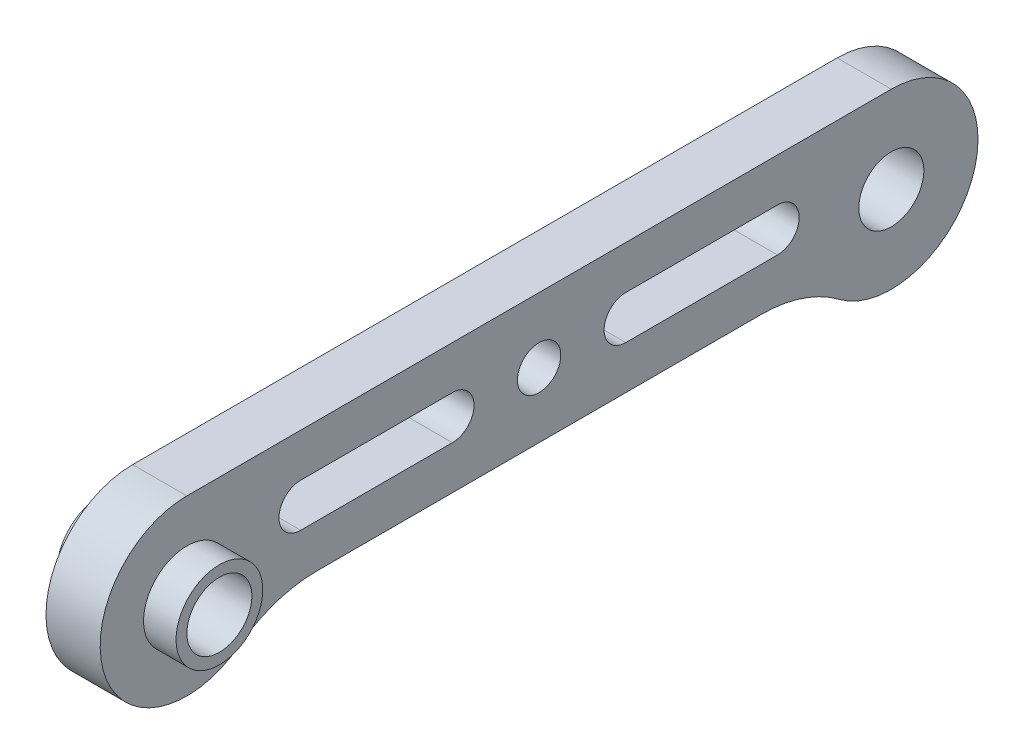
ISO-10303-21;
HEADER;
FILE_DESCRIPTION(('STEP AP214'),'2;1');
FILE_NAME('part.step','',(''),(''),'','','');
FILE_SCHEMA(('AUTOMOTIVE_DESIGN { 1 0 10303 214 1 1 1 1 }'));
ENDSEC;
DATA;
#1=APPLICATION_CONTEXT('core data for automotive mechanical design processes');
#2=APPLICATION_PROTOCOL_DEFINITION('international standard','automotive_design',2000,#1);
#3=PRODUCT_CONTEXT('',#1,'mechanical');
#4=PRODUCT('Part','Part','',(#3));
#5=PRODUCT_RELATED_PRODUCT_CATEGORY('part','',(#4));
#6=PRODUCT_DEFINITION_FORMATION('','',#4);
#7=PRODUCT_DEFINITION_CONTEXT('part definition',#1,'design');
#8=PRODUCT_DEFINITION('design','',#6,#7);
#9=PRODUCT_DEFINITION_SHAPE('','',#8);
#10=(LENGTH_UNIT() NAMED_UNIT(*) SI_UNIT(.MILLI.,.METRE.));
#11=(NAMED_UNIT(*) PLANE_ANGLE_UNIT() SI_UNIT($,.RADIAN.));
#12=(NAMED_UNIT(*) SI_UNIT($,.STERADIAN.) SOLID_ANGLE_UNIT());
#13=UNCERTAINTY_MEASURE_WITH_UNIT(LENGTH_MEASURE(1.E-05),#10,'distance_accuracy_value','');
#14=(GEOMETRIC_REPRESENTATION_CONTEXT(3) GLOBAL_UNCERTAINTY_ASSIGNED_CONTEXT((#13)) GLOBAL_UNIT_ASSIGNED_CONTEXT((#10,
#11,#12)) REPRESENTATION_CONTEXT('',''));
#15=CARTESIAN_POINT('',(0.,0.,0.));
#16=DIRECTION('',(0.,0.,1.));
#17=DIRECTION('',(1.,0.,0.));
#18=AXIS2_PLACEMENT_3D('',#15,#16,#17);
#19=CARTESIAN_POINT('',(5.,0.,0.));
#20=DIRECTION('',(1.,0.,0.));
#21=DIRECTION('',(0.,0.,1.));
#22=AXIS2_PLACEMENT_3D('',#19,#20,#21);
#23=PLANE('',#22);
#24=DIRECTION('',(0.,0.,-1.));
#25=VECTOR('',#24,1.);
#26=CARTESIAN_POINT('',(5.,-4.,0.));
#27=LINE('',#26,#25);
#28=CARTESIAN_POINT('',(5.,-4.,-12.));
#29=VERTEX_POINT('',#28);
#30=CARTESIAN_POINT('',(5.,-4.00000000000001,-53.));
#31=VERTEX_POINT('',#30);
#32=EDGE_CURVE('E218',#29,#31,#27,.T.);
#33=ORIENTED_EDGE('',*,*,#32,.T.);
#34=CARTESIAN_POINT('',(5.,-16.,-53.));
#35=DIRECTION('',(-1.,0.,0.));
#36=DIRECTION('',(0.,0.,1.));
#37=AXIS2_PLACEMENT_3D('',#34,#35,#36);
#38=CIRCLE('',#37,12.);
#39=CARTESIAN_POINT('',(5.,-6.40000000000001,-60.2));
#40=VERTEX_POINT('',#39);
#41=EDGE_CURVE('E47',#40,#31,#38,.F.);
#42=ORIENTED_EDGE('',*,*,#41,.F.);
#43=CARTESIAN_POINT('',(5.,0.,-65.));
#44=DIRECTION('',(-1.,0.,0.));
#45=DIRECTION('',(0.,0.,1.));
#46=AXIS2_PLACEMENT_3D('',#43,#44,#45);
#47=CIRCLE('',#46,8.);
#48=CARTESIAN_POINT('',(5.,7.99999999999999,-65.));
#49=VERTEX_POINT('',#48);
#50=EDGE_CURVE('E228',#49,#40,#47,.T.);
#51=ORIENTED_EDGE('',*,*,#50,.F.);
#52=DIRECTION('',(0.,0.,1.));
#53=VECTOR('',#52,1.);
#54=CARTESIAN_POINT('',(5.,8.,0.));
#55=LINE('',#54,#53);
#56=CARTESIAN_POINT('',(5.,8.,0.));
#57=VERTEX_POINT('',#56);
#58=EDGE_CURVE('E225',#49,#57,#55,.T.);
#59=ORIENTED_EDGE('',*,*,#58,.T.);
#60=CARTESIAN_POINT('',(5.,0.,0.));
#61=DIRECTION('',(-1.,0.,0.));
#62=DIRECTION('',(0.,0.,1.));
#63=AXIS2_PLACEMENT_3D('',#60,#61,#62);
#64=CIRCLE('',#63,8.);
#65=CARTESIAN_POINT('',(5.,-6.4,-4.8));
#66=VERTEX_POINT('',#65);
#67=EDGE_CURVE('E222',#66,#57,#64,.T.);
#68=ORIENTED_EDGE('',*,*,#67,.F.);
#69=CARTESIAN_POINT('',(5.,-16.,-12.));
#70=DIRECTION('',(-1.,0.,0.));
#71=DIRECTION('',(0.,0.,1.));
#72=AXIS2_PLACEMENT_3D('',#69,#70,#71);
#73=CIRCLE('',#72,12.);
#74=EDGE_CURVE('E259',#29,#66,#73,.F.);
#75=ORIENTED_EDGE('',*,*,#74,.F.);
#76=EDGE_LOOP('',(#33,#42,#51,#59,#68,#75));
#77=FACE_BOUND('',#76,.T.);
#78=CARTESIAN_POINT('',(5.,0.,-65.));
#79=DIRECTION('',(-1.,0.,0.));
#80=DIRECTION('',(0.,0.,1.));
#81=AXIS2_PLACEMENT_3D('',#78,#79,#80);
#82=CIRCLE('',#81,3.00000000000001);
#83=CARTESIAN_POINT('',(5.,0.,-62.));
#84=VERTEX_POINT('',#83);
#85=EDGE_CURVE('E215',#84,#84,#82,.T.);
#86=ORIENTED_EDGE('',*,*,#85,.T.);
#87=EDGE_LOOP('',(#86));
#88=FACE_BOUND('',#87,.T.);
#89=CARTESIAN_POINT('',(5.,1.99999999999999,-32.5));
#90=DIRECTION('',(-1.,0.,0.));
#91=DIRECTION('',(0.,0.,1.));
#92=AXIS2_PLACEMENT_3D('',#89,#90,#91);
#93=CIRCLE('',#92,2.);
#94=CARTESIAN_POINT('',(5.,1.99999999999999,-30.5));
#95=VERTEX_POINT('',#94);
#96=EDGE_CURVE('E176',#95,#95,#93,.T.);
#97=ORIENTED_EDGE('',*,*,#96,.T.);
#98=EDGE_LOOP('',(#97));
#99=FACE_BOUND('',#98,.T.);
#100=CARTESIAN_POINT('',(5.,1.99999999999999,-54.5));
#101=DIRECTION('',(-1.,0.,0.));
#102=DIRECTION('',(0.,0.,1.));
#103=AXIS2_PLACEMENT_3D('',#100,#101,#102);
#104=CIRCLE('',#103,2.);
#105=CARTESIAN_POINT('',(5.,3.99999999999999,-54.5));
#106=VERTEX_POINT('',#105);
#107=CARTESIAN_POINT('',(5.,0.,-54.5));
#108=VERTEX_POINT('',#107);
#109=EDGE_CURVE('E163',#106,#108,#104,.T.);
#110=ORIENTED_EDGE('',*,*,#109,.T.);
#111=DIRECTION('',(0.,0.,1.));
#112=VECTOR('',#111,1.);
#113=CARTESIAN_POINT('',(5.,0.,-54.5));
#114=LINE('',#113,#112);
#115=CARTESIAN_POINT('',(5.,0.,-40.5));
#116=VERTEX_POINT('',#115);
#117=EDGE_CURVE('E145',#108,#116,#114,.T.);
#118=ORIENTED_EDGE('',*,*,#117,.T.);
#119=CARTESIAN_POINT('',(5.,1.99999999999999,-40.5));
#120=DIRECTION('',(-1.,0.,0.));
#121=DIRECTION('',(0.,0.,1.));
#122=AXIS2_PLACEMENT_3D('',#119,#120,#121);
#123=CIRCLE('',#122,2.);
#124=CARTESIAN_POINT('',(5.,3.99999999999999,-40.5));
#125=VERTEX_POINT('',#124);
#126=EDGE_CURVE('E155',#116,#125,#123,.T.);
#127=ORIENTED_EDGE('',*,*,#126,.T.);
#128=DIRECTION('',(0.,0.,-1.));
#129=VECTOR('',#128,1.);
#130=CARTESIAN_POINT('',(5.,3.99999999999999,-54.5));
#131=LINE('',#130,#129);
#132=EDGE_CURVE('E160',#125,#106,#131,.T.);
#133=ORIENTED_EDGE('',*,*,#132,.T.);
#134=EDGE_LOOP('',(#110,#118,#127,#133));
#135=FACE_BOUND('',#134,.T.);
#136=CARTESIAN_POINT('',(5.,1.99999999999999,-24.5));
#137=DIRECTION('',(-1.,0.,0.));
#138=DIRECTION('',(0.,0.,1.));
#139=AXIS2_PLACEMENT_3D('',#136,#137,#138);
#140=CIRCLE('',#139,2.);
#141=CARTESIAN_POINT('',(5.,3.99999999999999,-24.5));
#142=VERTEX_POINT('',#141);
#143=CARTESIAN_POINT('',(5.,0.,-24.5));
#144=VERTEX_POINT('',#143);
#145=EDGE_CURVE('E188',#142,#144,#140,.T.);
#146=ORIENTED_EDGE('',*,*,#145,.T.);
#147=DIRECTION('',(0.,0.,1.));
#148=VECTOR('',#147,1.);
#149=CARTESIAN_POINT('',(5.,0.,-24.5));
#150=LINE('',#149,#148);
#151=CARTESIAN_POINT('',(5.,0.,-10.5));
#152=VERTEX_POINT('',#151);
#153=EDGE_CURVE('E191',#144,#152,#150,.T.);
#154=ORIENTED_EDGE('',*,*,#153,.T.);
#155=CARTESIAN_POINT('',(5.,1.99999999999999,-10.5));
#156=DIRECTION('',(-1.,0.,0.));
#157=DIRECTION('',(0.,0.,1.));
#158=AXIS2_PLACEMENT_3D('',#155,#156,#157);
#159=CIRCLE('',#158,2.);
#160=CARTESIAN_POINT('',(5.,3.99999999999999,-10.5));
#161=VERTEX_POINT('',#160);
#162=EDGE_CURVE('E195',#152,#161,#159,.T.);
#163=ORIENTED_EDGE('',*,*,#162,.T.);
#164=DIRECTION('',(0.,0.,-1.));
#165=VECTOR('',#164,1.);
#166=CARTESIAN_POINT('',(5.,3.99999999999999,-24.5));
#167=LINE('',#166,#165);
#168=EDGE_CURVE('E198',#161,#142,#167,.T.);
#169=ORIENTED_EDGE('',*,*,#168,.T.);
#170=EDGE_LOOP('',(#146,#154,#163,#169));
#171=FACE_BOUND('',#170,.T.);
#172=CARTESIAN_POINT('',(5.,0.,0.));
#173=DIRECTION('',(-1.,0.,0.));
#174=DIRECTION('',(0.,0.,1.));
#175=AXIS2_PLACEMENT_3D('',#172,#173,#174);
#176=CIRCLE('',#175,4.);
#177=CARTESIAN_POINT('',(5.,0.,4.));
#178=VERTEX_POINT('',#177);
#179=EDGE_CURVE('E332',#178,#178,#176,.T.);
#180=ORIENTED_EDGE('',*,*,#179,.T.);
#181=EDGE_LOOP('',(#180));
#182=FACE_BOUND('',#181,.T.);
#183=ADVANCED_FACE('F39',(#77,#88,#99,#135,#171,#182),#23,.T.);
#184=CARTESIAN_POINT('',(0.,0.,0.));
#185=DIRECTION('',(1.,0.,0.));
#186=DIRECTION('',(0.,0.,1.));
#187=AXIS2_PLACEMENT_3D('',#184,#185,#186);
#188=PLANE('',#187);
#189=CARTESIAN_POINT('',(0.,0.,0.));
#190=DIRECTION('',(-1.,0.,0.));
#191=DIRECTION('',(0.,0.,1.));
#192=AXIS2_PLACEMENT_3D('',#189,#190,#191);
#193=CIRCLE('',#192,8.);
#194=CARTESIAN_POINT('',(0.,-6.4,-4.8));
#195=VERTEX_POINT('',#194);
#196=CARTESIAN_POINT('',(0.,8.,0.));
#197=VERTEX_POINT('',#196);
#198=EDGE_CURVE('E237',#195,#197,#193,.T.);
#199=ORIENTED_EDGE('',*,*,#198,.T.);
#200=DIRECTION('',(0.,0.,1.));
#201=VECTOR('',#200,1.);
#202=CARTESIAN_POINT('',(0.,8.,0.));
#203=LINE('',#202,#201);
#204=CARTESIAN_POINT('',(0.,7.99999999999999,-65.));
#205=VERTEX_POINT('',#204);
#206=EDGE_CURVE('E240',#205,#197,#203,.T.);
#207=ORIENTED_EDGE('',*,*,#206,.F.);
#208=CARTESIAN_POINT('',(0.,0.,-65.));
#209=DIRECTION('',(-1.,0.,0.));
#210=DIRECTION('',(0.,0.,1.));
#211=AXIS2_PLACEMENT_3D('',#208,#209,#210);
#212=CIRCLE('',#211,8.);
#213=CARTESIAN_POINT('',(0.,-6.40000000000001,-60.2));
#214=VERTEX_POINT('',#213);
#215=EDGE_CURVE('E219',#205,#214,#212,.T.);
#216=ORIENTED_EDGE('',*,*,#215,.T.);
#217=CARTESIAN_POINT('',(0.,-16.,-53.));
#218=DIRECTION('',(-1.,0.,0.));
#219=DIRECTION('',(0.,0.,1.));
#220=AXIS2_PLACEMENT_3D('',#217,#218,#219);
#221=CIRCLE('',#220,12.);
#222=CARTESIAN_POINT('',(0.,-4.00000000000001,-53.));
#223=VERTEX_POINT('',#222);
#224=EDGE_CURVE('E262',#223,#214,#221,.T.);
#225=ORIENTED_EDGE('',*,*,#224,.F.);
#226=DIRECTION('',(0.,0.,-1.));
#227=VECTOR('',#226,1.);
#228=CARTESIAN_POINT('',(0.,-4.,0.));
#229=LINE('',#228,#227);
#230=CARTESIAN_POINT('',(0.,-4.,-12.));
#231=VERTEX_POINT('',#230);
#232=EDGE_CURVE('E234',#231,#223,#229,.T.);
#233=ORIENTED_EDGE('',*,*,#232,.F.);
#234=CARTESIAN_POINT('',(0.,-16.,-12.));
#235=DIRECTION('',(-1.,0.,0.));
#236=DIRECTION('',(0.,0.,1.));
#237=AXIS2_PLACEMENT_3D('',#234,#235,#236);
#238=CIRCLE('',#237,12.);
#239=EDGE_CURVE('E256',#195,#231,#238,.T.);
#240=ORIENTED_EDGE('',*,*,#239,.F.);
#241=EDGE_LOOP('',(#199,#207,#216,#225,#233,#240));
#242=FACE_BOUND('',#241,.T.);
#243=CARTESIAN_POINT('',(0.,0.,-65.));
#244=DIRECTION('',(-1.,0.,0.));
#245=DIRECTION('',(0.,0.,1.));
#246=AXIS2_PLACEMENT_3D('',#243,#244,#245);
#247=CIRCLE('',#246,3.00000000000001);
#248=CARTESIAN_POINT('',(0.,0.,-62.));
#249=VERTEX_POINT('',#248);
#250=EDGE_CURVE('E214',#249,#249,#247,.T.);
#251=ORIENTED_EDGE('',*,*,#250,.F.);
#252=EDGE_LOOP('',(#251));
#253=FACE_BOUND('',#252,.T.);
#254=CARTESIAN_POINT('',(0.,1.99999999999999,-32.5));
#255=DIRECTION('',(-1.,0.,0.));
#256=DIRECTION('',(0.,0.,1.));
#257=AXIS2_PLACEMENT_3D('',#254,#255,#256);
#258=CIRCLE('',#257,2.);
#259=CARTESIAN_POINT('',(0.,1.99999999999999,-30.5));
#260=VERTEX_POINT('',#259);
#261=EDGE_CURVE('E211',#260,#260,#258,.F.);
#262=ORIENTED_EDGE('',*,*,#261,.T.);
#263=EDGE_LOOP('',(#262));
#264=FACE_BOUND('',#263,.T.);
#265=DIRECTION('',(0.,0.,1.));
#266=VECTOR('',#265,1.);
#267=CARTESIAN_POINT('',(0.,3.99999999999999,-54.5));
#268=LINE('',#267,#266);
#269=CARTESIAN_POINT('',(0.,3.99999999999999,-54.5));
#270=VERTEX_POINT('',#269);
#271=CARTESIAN_POINT('',(0.,3.99999999999999,-40.5));
#272=VERTEX_POINT('',#271);
#273=EDGE_CURVE('E344',#270,#272,#268,.T.);
#274=ORIENTED_EDGE('',*,*,#273,.T.);
#275=CARTESIAN_POINT('',(0.,1.99999999999999,-40.5));
#276=DIRECTION('',(-1.,0.,0.));
#277=DIRECTION('',(0.,0.,1.));
#278=AXIS2_PLACEMENT_3D('',#275,#276,#277);
#279=CIRCLE('',#278,2.);
#280=CARTESIAN_POINT('',(0.,0.,-40.5));
#281=VERTEX_POINT('',#280);
#282=EDGE_CURVE('E172',#272,#281,#279,.F.);
#283=ORIENTED_EDGE('',*,*,#282,.T.);
#284=DIRECTION('',(0.,0.,-1.));
#285=VECTOR('',#284,1.);
#286=CARTESIAN_POINT('',(0.,0.,-54.5));
#287=LINE('',#286,#285);
#288=CARTESIAN_POINT('',(0.,0.,-54.5));
#289=VERTEX_POINT('',#288);
#290=EDGE_CURVE('E148',#281,#289,#287,.T.);
#291=ORIENTED_EDGE('',*,*,#290,.T.);
#292=CARTESIAN_POINT('',(0.,1.99999999999999,-54.5));
#293=DIRECTION('',(-1.,0.,0.));
#294=DIRECTION('',(0.,0.,1.));
#295=AXIS2_PLACEMENT_3D('',#292,#293,#294);
#296=CIRCLE('',#295,2.);
#297=EDGE_CURVE('E177',#289,#270,#296,.F.);
#298=ORIENTED_EDGE('',*,*,#297,.T.);
#299=EDGE_LOOP('',(#274,#283,#291,#298));
#300=FACE_BOUND('',#299,.T.);
#301=DIRECTION('',(0.,0.,1.));
#302=VECTOR('',#301,1.);
#303=CARTESIAN_POINT('',(0.,3.99999999999999,-24.5));
#304=LINE('',#303,#302);
#305=CARTESIAN_POINT('',(0.,3.99999999999999,-24.5));
#306=VERTEX_POINT('',#305);
#307=CARTESIAN_POINT('',(0.,3.99999999999999,-10.5));
#308=VERTEX_POINT('',#307);
#309=EDGE_CURVE('E181',#306,#308,#304,.T.);
#310=ORIENTED_EDGE('',*,*,#309,.T.);
#311=CARTESIAN_POINT('',(0.,1.99999999999999,-10.5));
#312=DIRECTION('',(-1.,0.,0.));
#313=DIRECTION('',(0.,0.,1.));
#314=AXIS2_PLACEMENT_3D('',#311,#312,#313);
#315=CIRCLE('',#314,2.);
#316=CARTESIAN_POINT('',(0.,0.,-10.5));
#317=VERTEX_POINT('',#316);
#318=EDGE_CURVE('E178',#308,#317,#315,.F.);
#319=ORIENTED_EDGE('',*,*,#318,.T.);
#320=DIRECTION('',(0.,0.,-1.));
#321=VECTOR('',#320,1.);
#322=CARTESIAN_POINT('',(0.,0.,-24.5));
#323=LINE('',#322,#321);
#324=CARTESIAN_POINT('',(0.,0.,-24.5));
#325=VERTEX_POINT('',#324);
#326=EDGE_CURVE('E165',#317,#325,#323,.T.);
#327=ORIENTED_EDGE('',*,*,#326,.T.);
#328=CARTESIAN_POINT('',(0.,1.99999999999999,-24.5));
#329=DIRECTION('',(-1.,0.,0.));
#330=DIRECTION('',(0.,0.,1.));
#331=AXIS2_PLACEMENT_3D('',#328,#329,#330);
#332=CIRCLE('',#331,2.);
#333=EDGE_CURVE('E185',#325,#306,#332,.F.);
#334=ORIENTED_EDGE('',*,*,#333,.T.);
#335=EDGE_LOOP('',(#310,#319,#327,#334));
#336=FACE_BOUND('',#335,.T.);
#337=CARTESIAN_POINT('',(0.,0.,0.));
#338=DIRECTION('',(-1.,0.,0.));
#339=DIRECTION('',(0.,0.,1.));
#340=AXIS2_PLACEMENT_3D('',#337,#338,#339);
#341=CIRCLE('',#340,4.);
#342=CARTESIAN_POINT('',(0.,0.,4.));
#343=VERTEX_POINT('',#342);
#344=EDGE_CURVE('E11',#343,#343,#341,.F.);
#345=ORIENTED_EDGE('',*,*,#344,.T.);
#346=EDGE_LOOP('',(#345));
#347=FACE_BOUND('',#346,.T.);
#348=ADVANCED_FACE('F279',(#242,#253,#264,#300,#336,#347),#188,.F.);
#349=CARTESIAN_POINT('',(5.,-4.,0.));
#350=DIRECTION('',(0.,-1.,0.));
#351=DIRECTION('',(0.,0.,1.));
#352=AXIS2_PLACEMENT_3D('',#349,#350,#351);
#353=PLANE('',#352);
#354=ORIENTED_EDGE('',*,*,#232,.T.);
#355=DIRECTION('',(-1.,0.,0.));
#356=VECTOR('',#355,1.);
#357=CARTESIAN_POINT('',(5.,-4.00000000000001,-53.));
#358=LINE('',#357,#356);
#359=EDGE_CURVE('E250',#31,#223,#358,.T.);
#360=ORIENTED_EDGE('',*,*,#359,.F.);
#361=ORIENTED_EDGE('',*,*,#32,.F.);
#362=DIRECTION('',(-1.,0.,0.));
#363=VECTOR('',#362,1.);
#364=CARTESIAN_POINT('',(5.,-4.,-12.));
#365=LINE('',#364,#363);
#366=EDGE_CURVE('E252',#231,#29,#365,.F.);
#367=ORIENTED_EDGE('',*,*,#366,.F.);
#368=EDGE_LOOP('',(#354,#360,#361,#367));
#369=FACE_BOUND('',#368,.T.);
#370=ADVANCED_FACE('F274',(#369),#353,.T.);
#371=CARTESIAN_POINT('',(5.,0.,0.));
#372=DIRECTION('',(-1.,0.,0.));
#373=DIRECTION('',(0.,0.,-1.));
#374=AXIS2_PLACEMENT_3D('',#371,#372,#373);
#375=CYLINDRICAL_SURFACE('',#374,8.);
#376=ORIENTED_EDGE('',*,*,#67,.T.);
#377=DIRECTION('',(-1.,0.,0.));
#378=VECTOR('',#377,1.);
#379=CARTESIAN_POINT('',(5.,8.,0.));
#380=LINE('',#379,#378);
#381=EDGE_CURVE('E246',#57,#197,#380,.T.);
#382=ORIENTED_EDGE('',*,*,#381,.T.);
#383=ORIENTED_EDGE('',*,*,#198,.F.);
#384=DIRECTION('',(-1.,0.,0.));
#385=VECTOR('',#384,1.);
#386=CARTESIAN_POINT('',(5.,-6.4,-4.8));
#387=LINE('',#386,#385);
#388=EDGE_CURVE('E248',#66,#195,#387,.T.);
#389=ORIENTED_EDGE('',*,*,#388,.F.);
#390=EDGE_LOOP('',(#376,#382,#383,#389));
#391=FACE_BOUND('',#390,.T.);
#392=ADVANCED_FACE('F290',(#391),#375,.T.);
#393=CARTESIAN_POINT('',(5.,8.,0.));
#394=DIRECTION('',(0.,1.,0.));
#395=DIRECTION('',(0.,0.,-1.));
#396=AXIS2_PLACEMENT_3D('',#393,#394,#395);
#397=PLANE('',#396);
#398=ORIENTED_EDGE('',*,*,#206,.T.);
#399=ORIENTED_EDGE('',*,*,#381,.F.);
#400=ORIENTED_EDGE('',*,*,#58,.F.);
#401=DIRECTION('',(-1.,0.,0.));
#402=VECTOR('',#401,1.);
#403=CARTESIAN_POINT('',(5.,7.99999999999999,-65.));
#404=LINE('',#403,#402);
#405=EDGE_CURVE('E231',#49,#205,#404,.T.);
#406=ORIENTED_EDGE('',*,*,#405,.T.);
#407=EDGE_LOOP('',(#398,#399,#400,#406));
#408=FACE_BOUND('',#407,.T.);
#409=ADVANCED_FACE('F287',(#408),#397,.T.);
#410=CARTESIAN_POINT('',(5.,0.,-65.));
#411=DIRECTION('',(-1.,0.,0.));
#412=DIRECTION('',(0.,0.,-1.));
#413=AXIS2_PLACEMENT_3D('',#410,#411,#412);
#414=CYLINDRICAL_SURFACE('',#413,3.00000000000001);
#415=ORIENTED_EDGE('',*,*,#85,.F.);
#416=EDGE_LOOP('',(#415));
#417=FACE_BOUND('',#416,.T.);
#418=ORIENTED_EDGE('',*,*,#250,.T.);
#419=EDGE_LOOP('',(#418));
#420=FACE_BOUND('',#419,.T.);
#421=ADVANCED_FACE('F313',(#417,#420),#414,.F.);
#422=CARTESIAN_POINT('',(5.,0.,0.));
#423=DIRECTION('',(-1.,0.,0.));
#424=DIRECTION('',(0.,0.,-1.));
#425=AXIS2_PLACEMENT_3D('',#422,#423,#424);
#426=CYLINDRICAL_SURFACE('',#425,3.);
#427=CARTESIAN_POINT('',(-3.,0.,0.));
#428=DIRECTION('',(1.,0.,0.));
#429=DIRECTION('',(0.,0.,-1.));
#430=AXIS2_PLACEMENT_3D('',#427,#428,#429);
#431=CIRCLE('',#430,3.);
#432=CARTESIAN_POINT('',(-3.,0.,-3.));
#433=VERTEX_POINT('',#432);
#434=EDGE_CURVE('E327',#433,#433,#431,.T.);
#435=ORIENTED_EDGE('',*,*,#434,.F.);
#436=EDGE_LOOP('',(#435));
#437=FACE_BOUND('',#436,.T.);
#438=CARTESIAN_POINT('',(8.,0.,0.));
#439=DIRECTION('',(-1.,0.,0.));
#440=DIRECTION('',(0.,0.,1.));
#441=AXIS2_PLACEMENT_3D('',#438,#439,#440);
#442=CIRCLE('',#441,3.);
#443=CARTESIAN_POINT('',(8.,0.,3.));
#444=VERTEX_POINT('',#443);
#445=EDGE_CURVE('E330',#444,#444,#442,.T.);
#446=ORIENTED_EDGE('',*,*,#445,.F.);
#447=EDGE_LOOP('',(#446));
#448=FACE_BOUND('',#447,.T.);
#449=ADVANCED_FACE('F299',(#437,#448),#426,.F.);
#450=CARTESIAN_POINT('',(5.,0.,-65.));
#451=DIRECTION('',(-1.,0.,0.));
#452=DIRECTION('',(0.,0.,-1.));
#453=AXIS2_PLACEMENT_3D('',#450,#451,#452);
#454=CYLINDRICAL_SURFACE('',#453,8.);
#455=ORIENTED_EDGE('',*,*,#215,.F.);
#456=ORIENTED_EDGE('',*,*,#405,.F.);
#457=ORIENTED_EDGE('',*,*,#50,.T.);
#458=DIRECTION('',(-1.,0.,0.));
#459=VECTOR('',#458,1.);
#460=CARTESIAN_POINT('',(5.,-6.40000000000001,-60.2));
#461=LINE('',#460,#459);
#462=EDGE_CURVE('E254',#214,#40,#461,.F.);
#463=ORIENTED_EDGE('',*,*,#462,.F.);
#464=EDGE_LOOP('',(#455,#456,#457,#463));
#465=FACE_BOUND('',#464,.T.);
#466=ADVANCED_FACE('F284',(#465),#454,.T.);
#467=CARTESIAN_POINT('',(5.,-16.,-12.));
#468=DIRECTION('',(-1.,0.,0.));
#469=DIRECTION('',(0.,0.,-1.));
#470=AXIS2_PLACEMENT_3D('',#467,#468,#469);
#471=CYLINDRICAL_SURFACE('',#470,12.);
#472=ORIENTED_EDGE('',*,*,#74,.T.);
#473=ORIENTED_EDGE('',*,*,#388,.T.);
#474=ORIENTED_EDGE('',*,*,#239,.T.);
#475=ORIENTED_EDGE('',*,*,#366,.T.);
#476=EDGE_LOOP('',(#472,#473,#474,#475));
#477=FACE_BOUND('',#476,.T.);
#478=ADVANCED_FACE('F292',(#477),#471,.F.);
#479=CARTESIAN_POINT('',(5.,-16.,-53.));
#480=DIRECTION('',(-1.,0.,0.));
#481=DIRECTION('',(0.,0.,-1.));
#482=AXIS2_PLACEMENT_3D('',#479,#480,#481);
#483=CYLINDRICAL_SURFACE('',#482,12.);
#484=ORIENTED_EDGE('',*,*,#41,.T.);
#485=ORIENTED_EDGE('',*,*,#359,.T.);
#486=ORIENTED_EDGE('',*,*,#224,.T.);
#487=ORIENTED_EDGE('',*,*,#462,.T.);
#488=EDGE_LOOP('',(#484,#485,#486,#487));
#489=FACE_BOUND('',#488,.T.);
#490=ADVANCED_FACE('F41',(#489),#483,.F.);
#491=CARTESIAN_POINT('',(-18.4390889145858,1.99999999999999,-32.5));
#492=DIRECTION('',(1.,0.,0.));
#493=DIRECTION('',(0.,0.,1.));
#494=AXIS2_PLACEMENT_3D('',#491,#492,#493);
#495=CYLINDRICAL_SURFACE('',#494,2.);
#496=ORIENTED_EDGE('',*,*,#261,.F.);
#497=EDGE_LOOP('',(#496));
#498=FACE_BOUND('',#497,.T.);
#499=ORIENTED_EDGE('',*,*,#96,.F.);
#500=EDGE_LOOP('',(#499));
#501=FACE_BOUND('',#500,.T.);
#502=ADVANCED_FACE('F298',(#498,#501),#495,.F.);
#503=CARTESIAN_POINT('',(-18.4390889145858,1.99999999999999,-54.5));
#504=DIRECTION('',(1.,0.,0.));
#505=DIRECTION('',(0.,0.,1.));
#506=AXIS2_PLACEMENT_3D('',#503,#504,#505);
#507=CYLINDRICAL_SURFACE('',#506,2.);
#508=ORIENTED_EDGE('',*,*,#297,.F.);
#509=DIRECTION('',(1.,0.,0.));
#510=VECTOR('',#509,1.);
#511=CARTESIAN_POINT('',(-18.4390889145858,0.,-54.5));
#512=LINE('',#511,#510);
#513=EDGE_CURVE('E62',#289,#108,#512,.T.);
#514=ORIENTED_EDGE('',*,*,#513,.T.);
#515=ORIENTED_EDGE('',*,*,#109,.F.);
#516=DIRECTION('',(1.,0.,0.));
#517=VECTOR('',#516,1.);
#518=CARTESIAN_POINT('',(-18.4390889145858,3.99999999999999,-54.5));
#519=LINE('',#518,#517);
#520=EDGE_CURVE('E170',#270,#106,#519,.T.);
#521=ORIENTED_EDGE('',*,*,#520,.F.);
#522=EDGE_LOOP('',(#508,#514,#515,#521));
#523=FACE_BOUND('',#522,.T.);
#524=ADVANCED_FACE('F352',(#523),#507,.F.);
#525=CARTESIAN_POINT('',(-18.4390889145858,3.99999999999999,-54.5));
#526=DIRECTION('',(0.,1.,0.));
#527=DIRECTION('',(0.,0.,-1.));
#528=AXIS2_PLACEMENT_3D('',#525,#526,#527);
#529=PLANE('',#528);
#530=ORIENTED_EDGE('',*,*,#273,.F.);
#531=ORIENTED_EDGE('',*,*,#520,.T.);
#532=ORIENTED_EDGE('',*,*,#132,.F.);
#533=DIRECTION('',(1.,0.,0.));
#534=VECTOR('',#533,1.);
#535=CARTESIAN_POINT('',(-18.4390889145858,3.99999999999999,-40.5));
#536=LINE('',#535,#534);
#537=EDGE_CURVE('E152',#272,#125,#536,.T.);
#538=ORIENTED_EDGE('',*,*,#537,.F.);
#539=EDGE_LOOP('',(#530,#531,#532,#538));
#540=FACE_BOUND('',#539,.T.);
#541=ADVANCED_FACE('F351',(#540),#529,.F.);
#542=CARTESIAN_POINT('',(-18.4390889145858,1.99999999999999,-40.5));
#543=DIRECTION('',(1.,0.,0.));
#544=DIRECTION('',(0.,0.,1.));
#545=AXIS2_PLACEMENT_3D('',#542,#543,#544);
#546=CYLINDRICAL_SURFACE('',#545,2.);
#547=ORIENTED_EDGE('',*,*,#282,.F.);
#548=ORIENTED_EDGE('',*,*,#537,.T.);
#549=ORIENTED_EDGE('',*,*,#126,.F.);
#550=DIRECTION('',(1.,0.,0.));
#551=VECTOR('',#550,1.);
#552=CARTESIAN_POINT('',(-18.4390889145858,0.,-40.5));
#553=LINE('',#552,#551);
#554=EDGE_CURVE('E141',#281,#116,#553,.T.);
#555=ORIENTED_EDGE('',*,*,#554,.F.);
#556=EDGE_LOOP('',(#547,#548,#549,#555));
#557=FACE_BOUND('',#556,.T.);
#558=ADVANCED_FACE('F156',(#557),#546,.F.);
#559=CARTESIAN_POINT('',(-18.4390889145858,0.,-54.5));
#560=DIRECTION('',(0.,-1.,0.));
#561=DIRECTION('',(0.,0.,1.));
#562=AXIS2_PLACEMENT_3D('',#559,#560,#561);
#563=PLANE('',#562);
#564=ORIENTED_EDGE('',*,*,#290,.F.);
#565=ORIENTED_EDGE('',*,*,#554,.T.);
#566=ORIENTED_EDGE('',*,*,#117,.F.);
#567=ORIENTED_EDGE('',*,*,#513,.F.);
#568=EDGE_LOOP('',(#564,#565,#566,#567));
#569=FACE_BOUND('',#568,.T.);
#570=ADVANCED_FACE('F143',(#569),#563,.F.);
#571=CARTESIAN_POINT('',(-18.4390889145858,1.99999999999999,-24.5));
#572=DIRECTION('',(1.,0.,0.));
#573=DIRECTION('',(0.,0.,1.));
#574=AXIS2_PLACEMENT_3D('',#571,#572,#573);
#575=CYLINDRICAL_SURFACE('',#574,2.);
#576=ORIENTED_EDGE('',*,*,#333,.F.);
#577=DIRECTION('',(1.,0.,0.));
#578=VECTOR('',#577,1.);
#579=CARTESIAN_POINT('',(-18.4390889145858,0.,-24.5));
#580=LINE('',#579,#578);
#581=EDGE_CURVE('E54',#325,#144,#580,.T.);
#582=ORIENTED_EDGE('',*,*,#581,.T.);
#583=ORIENTED_EDGE('',*,*,#145,.F.);
#584=DIRECTION('',(1.,0.,0.));
#585=VECTOR('',#584,1.);
#586=CARTESIAN_POINT('',(-18.4390889145858,3.99999999999999,-24.5));
#587=LINE('',#586,#585);
#588=EDGE_CURVE('E182',#306,#142,#587,.T.);
#589=ORIENTED_EDGE('',*,*,#588,.F.);
#590=EDGE_LOOP('',(#576,#582,#583,#589));
#591=FACE_BOUND('',#590,.T.);
#592=ADVANCED_FACE('F368',(#591),#575,.F.);
#593=CARTESIAN_POINT('',(-18.4390889145858,3.99999999999999,-24.5));
#594=DIRECTION('',(0.,1.,0.));
#595=DIRECTION('',(0.,0.,-1.));
#596=AXIS2_PLACEMENT_3D('',#593,#594,#595);
#597=PLANE('',#596);
#598=ORIENTED_EDGE('',*,*,#309,.F.);
#599=ORIENTED_EDGE('',*,*,#588,.T.);
#600=ORIENTED_EDGE('',*,*,#168,.F.);
#601=DIRECTION('',(1.,0.,0.));
#602=VECTOR('',#601,1.);
#603=CARTESIAN_POINT('',(-18.4390889145858,3.99999999999999,-10.5));
#604=LINE('',#603,#602);
#605=EDGE_CURVE('E202',#308,#161,#604,.T.);
#606=ORIENTED_EDGE('',*,*,#605,.F.);
#607=EDGE_LOOP('',(#598,#599,#600,#606));
#608=FACE_BOUND('',#607,.T.);
#609=ADVANCED_FACE('F364',(#608),#597,.F.);
#610=CARTESIAN_POINT('',(-18.4390889145858,1.99999999999999,-10.5));
#611=DIRECTION('',(1.,0.,0.));
#612=DIRECTION('',(0.,0.,1.));
#613=AXIS2_PLACEMENT_3D('',#610,#611,#612);
#614=CYLINDRICAL_SURFACE('',#613,2.);
#615=ORIENTED_EDGE('',*,*,#318,.F.);
#616=ORIENTED_EDGE('',*,*,#605,.T.);
#617=ORIENTED_EDGE('',*,*,#162,.F.);
#618=DIRECTION('',(1.,0.,0.));
#619=VECTOR('',#618,1.);
#620=CARTESIAN_POINT('',(-18.4390889145858,0.,-10.5));
#621=LINE('',#620,#619);
#622=EDGE_CURVE('E204',#317,#152,#621,.T.);
#623=ORIENTED_EDGE('',*,*,#622,.F.);
#624=EDGE_LOOP('',(#615,#616,#617,#623));
#625=FACE_BOUND('',#624,.T.);
#626=ADVANCED_FACE('F367',(#625),#614,.F.);
#627=CARTESIAN_POINT('',(-18.4390889145858,0.,-24.5));
#628=DIRECTION('',(0.,-1.,0.));
#629=DIRECTION('',(0.,0.,1.));
#630=AXIS2_PLACEMENT_3D('',#627,#628,#629);
#631=PLANE('',#630);
#632=ORIENTED_EDGE('',*,*,#326,.F.);
#633=ORIENTED_EDGE('',*,*,#622,.T.);
#634=ORIENTED_EDGE('',*,*,#153,.F.);
#635=ORIENTED_EDGE('',*,*,#581,.F.);
#636=EDGE_LOOP('',(#632,#633,#634,#635));
#637=FACE_BOUND('',#636,.T.);
#638=ADVANCED_FACE('F372',(#637),#631,.F.);
#639=CARTESIAN_POINT('',(-3.,0.,0.));
#640=DIRECTION('',(-1.,0.,0.));
#641=DIRECTION('',(0.,0.,-1.));
#642=AXIS2_PLACEMENT_3D('',#639,#640,#641);
#643=PLANE('',#642);
#644=CARTESIAN_POINT('',(-3.,0.,0.));
#645=DIRECTION('',(1.,0.,0.));
#646=DIRECTION('',(0.,0.,-1.));
#647=AXIS2_PLACEMENT_3D('',#644,#645,#646);
#648=CIRCLE('',#647,4.);
#649=CARTESIAN_POINT('',(-3.,0.,-4.));
#650=VERTEX_POINT('',#649);
#651=EDGE_CURVE('E192',#650,#650,#648,.T.);
#652=ORIENTED_EDGE('',*,*,#651,.F.);
#653=EDGE_LOOP('',(#652));
#654=FACE_BOUND('',#653,.T.);
#655=ORIENTED_EDGE('',*,*,#434,.T.);
#656=EDGE_LOOP('',(#655));
#657=FACE_BOUND('',#656,.T.);
#658=ADVANCED_FACE('F375',(#654,#657),#643,.T.);
#659=CARTESIAN_POINT('',(-3.,0.,0.));
#660=DIRECTION('',(1.,0.,0.));
#661=DIRECTION('',(0.,0.,1.));
#662=AXIS2_PLACEMENT_3D('',#659,#660,#661);
#663=CYLINDRICAL_SURFACE('',#662,4.);
#664=ORIENTED_EDGE('',*,*,#651,.T.);
#665=EDGE_LOOP('',(#664));
#666=FACE_BOUND('',#665,.T.);
#667=ORIENTED_EDGE('',*,*,#344,.F.);
#668=EDGE_LOOP('',(#667));
#669=FACE_BOUND('',#668,.T.);
#670=ADVANCED_FACE('F398',(#666,#669),#663,.T.);
#671=CARTESIAN_POINT('',(8.,0.,0.));
#672=DIRECTION('',(1.,0.,0.));
#673=DIRECTION('',(0.,0.,1.));
#674=AXIS2_PLACEMENT_3D('',#671,#672,#673);
#675=PLANE('',#674);
#676=CARTESIAN_POINT('',(8.,0.,0.));
#677=DIRECTION('',(-1.,0.,0.));
#678=DIRECTION('',(0.,0.,1.));
#679=AXIS2_PLACEMENT_3D('',#676,#677,#678);
#680=CIRCLE('',#679,4.);
#681=CARTESIAN_POINT('',(8.,0.,4.));
#682=VERTEX_POINT('',#681);
#683=EDGE_CURVE('E335',#682,#682,#680,.T.);
#684=ORIENTED_EDGE('',*,*,#683,.F.);
#685=EDGE_LOOP('',(#684));
#686=FACE_BOUND('',#685,.T.);
#687=ORIENTED_EDGE('',*,*,#445,.T.);
#688=EDGE_LOOP('',(#687));
#689=FACE_BOUND('',#688,.T.);
#690=ADVANCED_FACE('F392',(#686,#689),#675,.T.);
#691=CARTESIAN_POINT('',(8.,0.,0.));
#692=DIRECTION('',(-1.,0.,0.));
#693=DIRECTION('',(0.,0.,-1.));
#694=AXIS2_PLACEMENT_3D('',#691,#692,#693);
#695=CYLINDRICAL_SURFACE('',#694,4.);
#696=ORIENTED_EDGE('',*,*,#683,.T.);
#697=EDGE_LOOP('',(#696));
#698=FACE_BOUND('',#697,.T.);
#699=ORIENTED_EDGE('',*,*,#179,.F.);
#700=EDGE_LOOP('',(#699));
#701=FACE_BOUND('',#700,.T.);
#702=ADVANCED_FACE('F390',(#698,#701),#695,.T.);
#703=CLOSED_SHELL('',(#183,#348,#370,#392,#409,#421,#449,#466,#478,#490,#502,#524,#541,#558,
#570,#592,#609,#626,#638,#658,#670,#690,#702));
#704=MANIFOLD_SOLID_BREP('B2',#703);
#705=ADVANCED_BREP_SHAPE_REPRESENTATION('',(#18,#704),#14);
#706=SHAPE_DEFINITION_REPRESENTATION(#9,#705);
ENDSEC;
END-ISO-10303-21;
